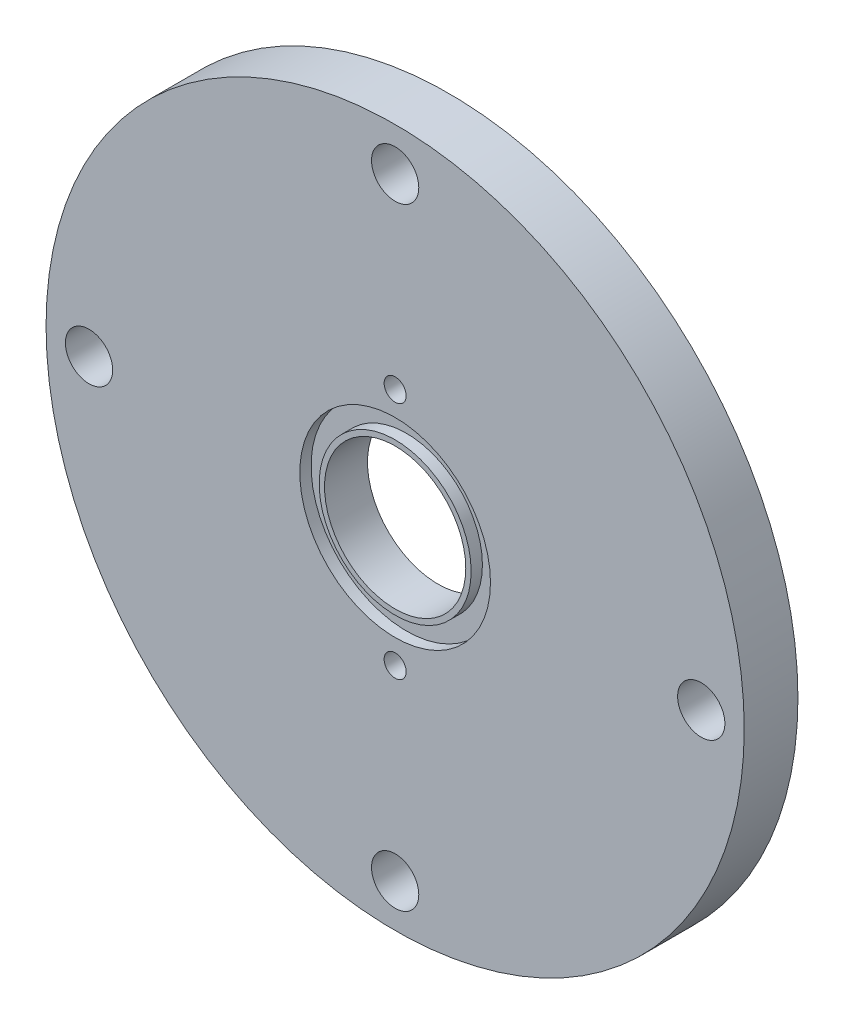
ISO-10303-21;
HEADER;
FILE_DESCRIPTION(('STEP AP214'),'2;1');
FILE_NAME('part.step','',(''),(''),'','','');
FILE_SCHEMA(('AUTOMOTIVE_DESIGN { 1 0 10303 214 1 1 1 1 }'));
ENDSEC;
DATA;
#1=APPLICATION_CONTEXT('core data for automotive mechanical design processes');
#2=APPLICATION_PROTOCOL_DEFINITION('international standard','automotive_design',2000,#1);
#3=PRODUCT_CONTEXT('',#1,'mechanical');
#4=PRODUCT('Part','Part','',(#3));
#5=PRODUCT_RELATED_PRODUCT_CATEGORY('part','',(#4));
#6=PRODUCT_DEFINITION_FORMATION('','',#4);
#7=PRODUCT_DEFINITION_CONTEXT('part definition',#1,'design');
#8=PRODUCT_DEFINITION('design','',#6,#7);
#9=PRODUCT_DEFINITION_SHAPE('','',#8);
#10=(LENGTH_UNIT() NAMED_UNIT(*) SI_UNIT(.MILLI.,.METRE.));
#11=(NAMED_UNIT(*) PLANE_ANGLE_UNIT() SI_UNIT($,.RADIAN.));
#12=(NAMED_UNIT(*) SI_UNIT($,.STERADIAN.) SOLID_ANGLE_UNIT());
#13=UNCERTAINTY_MEASURE_WITH_UNIT(LENGTH_MEASURE(1.E-05),#10,'distance_accuracy_value','');
#14=(GEOMETRIC_REPRESENTATION_CONTEXT(3) GLOBAL_UNCERTAINTY_ASSIGNED_CONTEXT((#13)) GLOBAL_UNIT_ASSIGNED_CONTEXT((#10,
#11,#12)) REPRESENTATION_CONTEXT('',''));
#15=CARTESIAN_POINT('',(0.,0.,0.));
#16=DIRECTION('',(0.,0.,1.));
#17=DIRECTION('',(1.,0.,0.));
#18=AXIS2_PLACEMENT_3D('',#15,#16,#17);
#19=CARTESIAN_POINT('',(20.,0.,-5.));
#20=DIRECTION('',(0.,0.,1.));
#21=DIRECTION('',(1.,0.,0.));
#22=AXIS2_PLACEMENT_3D('',#19,#20,#21);
#23=PLANE('',#22);
#24=CARTESIAN_POINT('',(20.,0.,-5.));
#25=DIRECTION('',(0.,0.,1.));
#26=DIRECTION('',(1.,0.,0.));
#27=AXIS2_PLACEMENT_3D('',#24,#25,#26);
#28=CIRCLE('',#27,8.875);
#29=CARTESIAN_POINT('',(28.875,0.,-5.));
#30=VERTEX_POINT('',#29);
#31=EDGE_CURVE('E189',#30,#30,#28,.T.);
#32=ORIENTED_EDGE('',*,*,#31,.T.);
#33=EDGE_LOOP('',(#32));
#34=FACE_BOUND('',#33,.T.);
#35=CARTESIAN_POINT('',(20.,0.,-5.));
#36=DIRECTION('',(0.,0.,-1.));
#37=DIRECTION('',(-1.,0.,0.));
#38=AXIS2_PLACEMENT_3D('',#35,#36,#37);
#39=CIRCLE('',#38,15.6);
#40=CARTESIAN_POINT('',(4.39999999999999,0.,-5.));
#41=VERTEX_POINT('',#40);
#42=EDGE_CURVE('E234',#41,#41,#39,.T.);
#43=ORIENTED_EDGE('',*,*,#42,.T.);
#44=EDGE_LOOP('',(#43));
#45=FACE_BOUND('',#44,.T.);
#46=ADVANCED_FACE('F47',(#34,#45),#23,.F.);
#47=CARTESIAN_POINT('',(0.,0.,-3.99999999999999));
#48=DIRECTION('',(0.,0.,1.));
#49=DIRECTION('',(1.,0.,0.));
#50=AXIS2_PLACEMENT_3D('',#47,#48,#49);
#51=PLANE('',#50);
#52=CARTESIAN_POINT('',(20.,0.,-3.99999999999999));
#53=DIRECTION('',(0.,0.,1.));
#54=DIRECTION('',(1.,0.,0.));
#55=AXIS2_PLACEMENT_3D('',#52,#53,#54);
#56=CIRCLE('',#55,6.575);
#57=CARTESIAN_POINT('',(26.575,0.,-3.99999999999999));
#58=VERTEX_POINT('',#57);
#59=EDGE_CURVE('E84',#58,#58,#56,.T.);
#60=ORIENTED_EDGE('',*,*,#59,.T.);
#61=EDGE_LOOP('',(#60));
#62=FACE_BOUND('',#61,.T.);
#63=CARTESIAN_POINT('',(20.,0.,-3.99999999999999));
#64=DIRECTION('',(0.,0.,1.));
#65=DIRECTION('',(1.,0.,0.));
#66=AXIS2_PLACEMENT_3D('',#63,#64,#65);
#67=CIRCLE('',#66,8.875);
#68=CARTESIAN_POINT('',(28.875,0.,-3.99999999999999));
#69=VERTEX_POINT('',#68);
#70=EDGE_CURVE('E11',#69,#69,#67,.T.);
#71=ORIENTED_EDGE('',*,*,#70,.F.);
#72=EDGE_LOOP('',(#71));
#73=FACE_BOUND('',#72,.T.);
#74=ADVANCED_FACE('F127',(#62,#73),#51,.F.);
#75=CARTESIAN_POINT('',(0.,0.,0.));
#76=DIRECTION('',(0.,0.,1.));
#77=DIRECTION('',(1.,0.,0.));
#78=AXIS2_PLACEMENT_3D('',#75,#76,#77);
#79=PLANE('',#78);
#80=CARTESIAN_POINT('',(20.,0.,0.));
#81=DIRECTION('',(0.,0.,1.));
#82=DIRECTION('',(1.,0.,0.));
#83=AXIS2_PLACEMENT_3D('',#80,#81,#82);
#84=CIRCLE('',#83,6.575);
#85=CARTESIAN_POINT('',(26.575,0.,0.));
#86=VERTEX_POINT('',#85);
#87=EDGE_CURVE('E89',#86,#86,#84,.T.);
#88=ORIENTED_EDGE('',*,*,#87,.F.);
#89=EDGE_LOOP('',(#88));
#90=FACE_BOUND('',#89,.T.);
#91=CARTESIAN_POINT('',(20.,0.,0.));
#92=DIRECTION('',(0.,0.,1.));
#93=DIRECTION('',(1.,0.,0.));
#94=AXIS2_PLACEMENT_3D('',#91,#92,#93);
#95=CIRCLE('',#94,7.075);
#96=CARTESIAN_POINT('',(27.075,0.,0.));
#97=VERTEX_POINT('',#96);
#98=EDGE_CURVE('E71',#97,#97,#95,.T.);
#99=ORIENTED_EDGE('',*,*,#98,.T.);
#100=EDGE_LOOP('',(#99));
#101=FACE_BOUND('',#100,.T.);
#102=ADVANCED_FACE('F132',(#90,#101),#79,.T.);
#103=CARTESIAN_POINT('',(20.,11.1252,-3.99999999999999));
#104=DIRECTION('',(0.,0.,1.));
#105=DIRECTION('',(1.,0.,0.));
#106=AXIS2_PLACEMENT_3D('',#103,#104,#105);
#107=CYLINDRICAL_SURFACE('',#106,1.025);
#108=CARTESIAN_POINT('',(20.,11.1252,-2.25));
#109=DIRECTION('',(0.,0.,1.));
#110=DIRECTION('',(1.,0.,0.));
#111=AXIS2_PLACEMENT_3D('',#108,#109,#110);
#112=CIRCLE('',#111,1.025);
#113=CARTESIAN_POINT('',(21.025,11.1252,-2.25));
#114=VERTEX_POINT('',#113);
#115=EDGE_CURVE('E51',#114,#114,#112,.F.);
#116=ORIENTED_EDGE('',*,*,#115,.T.);
#117=EDGE_LOOP('',(#116));
#118=FACE_BOUND('',#117,.T.);
#119=CARTESIAN_POINT('',(20.,11.1252,0.));
#120=DIRECTION('',(0.,0.,1.));
#121=DIRECTION('',(1.,0.,0.));
#122=AXIS2_PLACEMENT_3D('',#119,#120,#121);
#123=CIRCLE('',#122,1.025);
#124=CARTESIAN_POINT('',(21.025,11.1252,0.));
#125=VERTEX_POINT('',#124);
#126=EDGE_CURVE('E93',#125,#125,#123,.F.);
#127=ORIENTED_EDGE('',*,*,#126,.F.);
#128=EDGE_LOOP('',(#127));
#129=FACE_BOUND('',#128,.T.);
#130=ADVANCED_FACE('F170',(#118,#129),#107,.F.);
#131=CARTESIAN_POINT('',(20.,-11.1252,-3.99999999999999));
#132=DIRECTION('',(0.,0.,1.));
#133=DIRECTION('',(1.,0.,0.));
#134=AXIS2_PLACEMENT_3D('',#131,#132,#133);
#135=CYLINDRICAL_SURFACE('',#134,1.025);
#136=CARTESIAN_POINT('',(20.,-11.1252,-2.25));
#137=DIRECTION('',(0.,0.,1.));
#138=DIRECTION('',(1.,0.,0.));
#139=AXIS2_PLACEMENT_3D('',#136,#137,#138);
#140=CIRCLE('',#139,1.025);
#141=CARTESIAN_POINT('',(21.025,-11.1252,-2.25));
#142=VERTEX_POINT('',#141);
#143=EDGE_CURVE('E103',#142,#142,#140,.F.);
#144=ORIENTED_EDGE('',*,*,#143,.T.);
#145=EDGE_LOOP('',(#144));
#146=FACE_BOUND('',#145,.T.);
#147=CARTESIAN_POINT('',(20.,-11.1252,0.));
#148=DIRECTION('',(0.,0.,1.));
#149=DIRECTION('',(1.,0.,0.));
#150=AXIS2_PLACEMENT_3D('',#147,#148,#149);
#151=CIRCLE('',#150,1.025);
#152=CARTESIAN_POINT('',(21.025,-11.1252,0.));
#153=VERTEX_POINT('',#152);
#154=EDGE_CURVE('E80',#153,#153,#151,.F.);
#155=ORIENTED_EDGE('',*,*,#154,.F.);
#156=EDGE_LOOP('',(#155));
#157=FACE_BOUND('',#156,.T.);
#158=ADVANCED_FACE('F168',(#146,#157),#135,.F.);
#159=CARTESIAN_POINT('',(20.,0.,-3.99999999999999));
#160=DIRECTION('',(0.,0.,1.));
#161=DIRECTION('',(1.,0.,0.));
#162=AXIS2_PLACEMENT_3D('',#159,#160,#161);
#163=CYLINDRICAL_SURFACE('',#162,6.575);
#164=ORIENTED_EDGE('',*,*,#59,.F.);
#165=EDGE_LOOP('',(#164));
#166=FACE_BOUND('',#165,.T.);
#167=ORIENTED_EDGE('',*,*,#87,.T.);
#168=EDGE_LOOP('',(#167));
#169=FACE_BOUND('',#168,.T.);
#170=ADVANCED_FACE('F164',(#166,#169),#163,.F.);
#171=CARTESIAN_POINT('',(20.,-28.5,0.));
#172=DIRECTION('',(0.,0.,1.));
#173=DIRECTION('',(1.,0.,0.));
#174=AXIS2_PLACEMENT_3D('',#171,#172,#173);
#175=CIRCLE('',#174,2.19999999999999);
#176=CARTESIAN_POINT('',(22.2,-28.5,0.));
#177=VERTEX_POINT('',#176);
#178=EDGE_CURVE('E198',#177,#177,#175,.F.);
#179=ORIENTED_EDGE('',*,*,#178,.T.);
#180=EDGE_LOOP('',(#179));
#181=FACE_BOUND('',#180,.T.);
#182=CARTESIAN_POINT('',(48.4962655333548,-0.461357402168694,0.));
#183=DIRECTION('',(0.,0.,1.));
#184=DIRECTION('',(1.,0.,0.));
#185=AXIS2_PLACEMENT_3D('',#182,#183,#184);
#186=CIRCLE('',#185,2.2);
#187=CARTESIAN_POINT('',(50.6962655333548,-0.461357402168694,0.));
#188=VERTEX_POINT('',#187);
#189=EDGE_CURVE('E222',#188,#188,#186,.F.);
#190=ORIENTED_EDGE('',*,*,#189,.T.);
#191=EDGE_LOOP('',(#190));
#192=FACE_BOUND('',#191,.T.);
#193=CARTESIAN_POINT('',(20.,28.5,0.));
#194=DIRECTION('',(0.,0.,1.));
#195=DIRECTION('',(1.,0.,0.));
#196=AXIS2_PLACEMENT_3D('',#193,#194,#195);
#197=CIRCLE('',#196,2.19999999999999);
#198=CARTESIAN_POINT('',(22.2,28.5,0.));
#199=VERTEX_POINT('',#198);
#200=EDGE_CURVE('E214',#199,#199,#197,.F.);
#201=ORIENTED_EDGE('',*,*,#200,.T.);
#202=EDGE_LOOP('',(#201));
#203=FACE_BOUND('',#202,.T.);
#204=CARTESIAN_POINT('',(-8.49626553335479,-0.461357402168693,0.));
#205=DIRECTION('',(0.,0.,1.));
#206=DIRECTION('',(1.,0.,0.));
#207=AXIS2_PLACEMENT_3D('',#204,#205,#206);
#208=CIRCLE('',#207,2.2);
#209=CARTESIAN_POINT('',(-6.29626553335479,-0.461357402168693,0.));
#210=VERTEX_POINT('',#209);
#211=EDGE_CURVE('E205',#210,#210,#208,.F.);
#212=ORIENTED_EDGE('',*,*,#211,.T.);
#213=EDGE_LOOP('',(#212));
#214=FACE_BOUND('',#213,.T.);
#215=CARTESIAN_POINT('',(20.,0.,0.));
#216=DIRECTION('',(0.,0.,1.));
#217=DIRECTION('',(1.,0.,0.));
#218=AXIS2_PLACEMENT_3D('',#215,#216,#217);
#219=CIRCLE('',#218,8.875);
#220=CARTESIAN_POINT('',(28.875,0.,0.));
#221=VERTEX_POINT('',#220);
#222=EDGE_CURVE('E70',#221,#221,#219,.T.);
#223=ORIENTED_EDGE('',*,*,#222,.F.);
#224=EDGE_LOOP('',(#223));
#225=FACE_BOUND('',#224,.T.);
#226=ORIENTED_EDGE('',*,*,#154,.T.);
#227=EDGE_LOOP('',(#226));
#228=FACE_BOUND('',#227,.T.);
#229=ORIENTED_EDGE('',*,*,#126,.T.);
#230=EDGE_LOOP('',(#229));
#231=FACE_BOUND('',#230,.T.);
#232=CARTESIAN_POINT('',(20.,0.,0.));
#233=DIRECTION('',(0.,0.,1.));
#234=DIRECTION('',(1.,0.,0.));
#235=AXIS2_PLACEMENT_3D('',#232,#233,#234);
#236=CIRCLE('',#235,32.5);
#237=CARTESIAN_POINT('',(52.5,0.,0.));
#238=VERTEX_POINT('',#237);
#239=EDGE_CURVE('E64',#238,#238,#236,.T.);
#240=ORIENTED_EDGE('',*,*,#239,.T.);
#241=EDGE_LOOP('',(#240));
#242=FACE_BOUND('',#241,.T.);
#243=ADVANCED_FACE('F159',(#181,#192,#203,#214,#225,#228,#231,#242),#79,.T.);
#244=CARTESIAN_POINT('',(20.,0.,-1.05));
#245=DIRECTION('',(0.,0.,1.));
#246=DIRECTION('',(1.,0.,0.));
#247=AXIS2_PLACEMENT_3D('',#244,#245,#246);
#248=CYLINDRICAL_SURFACE('',#247,8.875);
#249=CARTESIAN_POINT('',(20.,0.,-1.05));
#250=DIRECTION('',(0.,0.,1.));
#251=DIRECTION('',(1.,0.,0.));
#252=AXIS2_PLACEMENT_3D('',#249,#250,#251);
#253=CIRCLE('',#252,8.875);
#254=CARTESIAN_POINT('',(28.875,0.,-1.05));
#255=VERTEX_POINT('',#254);
#256=EDGE_CURVE('E76',#255,#255,#253,.T.);
#257=ORIENTED_EDGE('',*,*,#256,.F.);
#258=EDGE_LOOP('',(#257));
#259=FACE_BOUND('',#258,.T.);
#260=ORIENTED_EDGE('',*,*,#222,.T.);
#261=EDGE_LOOP('',(#260));
#262=FACE_BOUND('',#261,.T.);
#263=ADVANCED_FACE('F156',(#259,#262),#248,.F.);
#264=CARTESIAN_POINT('',(20.,0.,-1.05));
#265=DIRECTION('',(0.,0.,1.));
#266=DIRECTION('',(1.,0.,0.));
#267=AXIS2_PLACEMENT_3D('',#264,#265,#266);
#268=PLANE('',#267);
#269=CARTESIAN_POINT('',(20.,0.,-1.05));
#270=DIRECTION('',(0.,0.,1.));
#271=DIRECTION('',(1.,0.,0.));
#272=AXIS2_PLACEMENT_3D('',#269,#270,#271);
#273=CIRCLE('',#272,7.075);
#274=CARTESIAN_POINT('',(27.075,0.,-1.05));
#275=VERTEX_POINT('',#274);
#276=EDGE_CURVE('E66',#275,#275,#273,.T.);
#277=ORIENTED_EDGE('',*,*,#276,.F.);
#278=EDGE_LOOP('',(#277));
#279=FACE_BOUND('',#278,.T.);
#280=ORIENTED_EDGE('',*,*,#256,.T.);
#281=EDGE_LOOP('',(#280));
#282=FACE_BOUND('',#281,.T.);
#283=ADVANCED_FACE('F152',(#279,#282),#268,.T.);
#284=CARTESIAN_POINT('',(20.,0.,-1.05));
#285=DIRECTION('',(0.,0.,1.));
#286=DIRECTION('',(1.,0.,0.));
#287=AXIS2_PLACEMENT_3D('',#284,#285,#286);
#288=CYLINDRICAL_SURFACE('',#287,7.075);
#289=ORIENTED_EDGE('',*,*,#276,.T.);
#290=EDGE_LOOP('',(#289));
#291=FACE_BOUND('',#290,.T.);
#292=ORIENTED_EDGE('',*,*,#98,.F.);
#293=EDGE_LOOP('',(#292));
#294=FACE_BOUND('',#293,.T.);
#295=ADVANCED_FACE('F149',(#291,#294),#288,.T.);
#296=CARTESIAN_POINT('',(20.,11.1252,-3.25));
#297=DIRECTION('',(0.,0.,1.));
#298=DIRECTION('',(1.,0.,0.));
#299=AXIS2_PLACEMENT_3D('',#296,#297,#298);
#300=PLANE('',#299);
#301=CARTESIAN_POINT('',(20.,11.1252,-3.25));
#302=DIRECTION('',(0.,0.,1.));
#303=DIRECTION('',(1.,0.,0.));
#304=AXIS2_PLACEMENT_3D('',#301,#302,#303);
#305=CIRCLE('',#304,0.0250000000000001);
#306=CARTESIAN_POINT('',(20.025,11.1252,-3.25));
#307=VERTEX_POINT('',#306);
#308=EDGE_CURVE('E61',#307,#307,#305,.T.);
#309=ORIENTED_EDGE('',*,*,#308,.T.);
#310=EDGE_LOOP('',(#309));
#311=FACE_BOUND('',#310,.T.);
#312=ADVANCED_FACE('F110',(#311),#300,.T.);
#313=CARTESIAN_POINT('',(20.,-11.1252,-3.25));
#314=DIRECTION('',(0.,0.,1.));
#315=DIRECTION('',(1.,0.,0.));
#316=AXIS2_PLACEMENT_3D('',#313,#314,#315);
#317=PLANE('',#316);
#318=CARTESIAN_POINT('',(20.,-11.1252,-3.25));
#319=DIRECTION('',(0.,0.,1.));
#320=DIRECTION('',(1.,0.,0.));
#321=AXIS2_PLACEMENT_3D('',#318,#319,#320);
#322=CIRCLE('',#321,0.0250000000000001);
#323=CARTESIAN_POINT('',(20.025,-11.1252,-3.25));
#324=VERTEX_POINT('',#323);
#325=EDGE_CURVE('E88',#324,#324,#322,.T.);
#326=ORIENTED_EDGE('',*,*,#325,.T.);
#327=EDGE_LOOP('',(#326));
#328=FACE_BOUND('',#327,.T.);
#329=ADVANCED_FACE('F123',(#328),#317,.T.);
#330=CARTESIAN_POINT('',(20.,-11.1252,-2.25));
#331=DIRECTION('',(0.,0.,1.));
#332=DIRECTION('',(1.,0.,0.));
#333=AXIS2_PLACEMENT_3D('',#330,#331,#332);
#334=DEGENERATE_TOROIDAL_SURFACE('',#333,0.0250000000000001,1.,.T.);
#335=ORIENTED_EDGE('',*,*,#143,.F.);
#336=EDGE_LOOP('',(#335));
#337=FACE_BOUND('',#336,.T.);
#338=ORIENTED_EDGE('',*,*,#325,.F.);
#339=EDGE_LOOP('',(#338));
#340=FACE_BOUND('',#339,.T.);
#341=ADVANCED_FACE('F114',(#337,#340),#334,.F.);
#342=CARTESIAN_POINT('',(20.,11.1252,-2.25));
#343=DIRECTION('',(0.,0.,1.));
#344=DIRECTION('',(1.,0.,0.));
#345=AXIS2_PLACEMENT_3D('',#342,#343,#344);
#346=DEGENERATE_TOROIDAL_SURFACE('',#345,0.0250000000000001,1.,.T.);
#347=ORIENTED_EDGE('',*,*,#115,.F.);
#348=EDGE_LOOP('',(#347));
#349=FACE_BOUND('',#348,.T.);
#350=ORIENTED_EDGE('',*,*,#308,.F.);
#351=EDGE_LOOP('',(#350));
#352=FACE_BOUND('',#351,.T.);
#353=ADVANCED_FACE('F49',(#349,#352),#346,.F.);
#354=CARTESIAN_POINT('',(20.,0.,-5.));
#355=DIRECTION('',(0.,0.,-1.));
#356=DIRECTION('',(-1.,0.,0.));
#357=AXIS2_PLACEMENT_3D('',#354,#355,#356);
#358=CIRCLE('',#357,20.6);
#359=CARTESIAN_POINT('',(-0.60000000000001,0.,-5.));
#360=VERTEX_POINT('',#359);
#361=EDGE_CURVE('E229',#360,#360,#358,.T.);
#362=ORIENTED_EDGE('',*,*,#361,.F.);
#363=EDGE_LOOP('',(#362));
#364=FACE_BOUND('',#363,.T.);
#365=CARTESIAN_POINT('',(20.,-28.5,-5.));
#366=DIRECTION('',(0.,0.,1.));
#367=DIRECTION('',(1.,0.,0.));
#368=AXIS2_PLACEMENT_3D('',#365,#366,#367);
#369=CIRCLE('',#368,2.19999999999999);
#370=CARTESIAN_POINT('',(22.2,-28.5,-5.));
#371=VERTEX_POINT('',#370);
#372=EDGE_CURVE('E193',#371,#371,#369,.F.);
#373=ORIENTED_EDGE('',*,*,#372,.F.);
#374=EDGE_LOOP('',(#373));
#375=FACE_BOUND('',#374,.T.);
#376=CARTESIAN_POINT('',(48.4962655333548,-0.461357402168694,-5.));
#377=DIRECTION('',(0.,0.,1.));
#378=DIRECTION('',(1.,0.,0.));
#379=AXIS2_PLACEMENT_3D('',#376,#377,#378);
#380=CIRCLE('',#379,2.2);
#381=CARTESIAN_POINT('',(50.6962655333548,-0.461357402168694,-5.));
#382=VERTEX_POINT('',#381);
#383=EDGE_CURVE('E218',#382,#382,#380,.F.);
#384=ORIENTED_EDGE('',*,*,#383,.F.);
#385=EDGE_LOOP('',(#384));
#386=FACE_BOUND('',#385,.T.);
#387=CARTESIAN_POINT('',(20.,28.5,-5.));
#388=DIRECTION('',(0.,0.,1.));
#389=DIRECTION('',(1.,0.,0.));
#390=AXIS2_PLACEMENT_3D('',#387,#388,#389);
#391=CIRCLE('',#390,2.19999999999999);
#392=CARTESIAN_POINT('',(22.2,28.5,-5.));
#393=VERTEX_POINT('',#392);
#394=EDGE_CURVE('E210',#393,#393,#391,.F.);
#395=ORIENTED_EDGE('',*,*,#394,.F.);
#396=EDGE_LOOP('',(#395));
#397=FACE_BOUND('',#396,.T.);
#398=CARTESIAN_POINT('',(-8.49626553335479,-0.461357402168693,-5.));
#399=DIRECTION('',(0.,0.,1.));
#400=DIRECTION('',(1.,0.,0.));
#401=AXIS2_PLACEMENT_3D('',#398,#399,#400);
#402=CIRCLE('',#401,2.2);
#403=CARTESIAN_POINT('',(-6.29626553335479,-0.461357402168693,-5.));
#404=VERTEX_POINT('',#403);
#405=EDGE_CURVE('E201',#404,#404,#402,.F.);
#406=ORIENTED_EDGE('',*,*,#405,.F.);
#407=EDGE_LOOP('',(#406));
#408=FACE_BOUND('',#407,.T.);
#409=CARTESIAN_POINT('',(20.,0.,-5.));
#410=DIRECTION('',(0.,0.,1.));
#411=DIRECTION('',(1.,0.,0.));
#412=AXIS2_PLACEMENT_3D('',#409,#410,#411);
#413=CIRCLE('',#412,32.5);
#414=CARTESIAN_POINT('',(52.5,0.,-5.));
#415=VERTEX_POINT('',#414);
#416=EDGE_CURVE('E75',#415,#415,#413,.T.);
#417=ORIENTED_EDGE('',*,*,#416,.F.);
#418=EDGE_LOOP('',(#417));
#419=FACE_BOUND('',#418,.T.);
#420=ADVANCED_FACE('F113',(#364,#375,#386,#397,#408,#419),#23,.F.);
#421=CARTESIAN_POINT('',(20.,0.,-5.));
#422=DIRECTION('',(0.,0.,1.));
#423=DIRECTION('',(1.,0.,0.));
#424=AXIS2_PLACEMENT_3D('',#421,#422,#423);
#425=CYLINDRICAL_SURFACE('',#424,32.5);
#426=ORIENTED_EDGE('',*,*,#416,.T.);
#427=EDGE_LOOP('',(#426));
#428=FACE_BOUND('',#427,.T.);
#429=ORIENTED_EDGE('',*,*,#239,.F.);
#430=EDGE_LOOP('',(#429));
#431=FACE_BOUND('',#430,.T.);
#432=ADVANCED_FACE('F120',(#428,#431),#425,.T.);
#433=CARTESIAN_POINT('',(20.,0.,-5.));
#434=DIRECTION('',(0.,0.,1.));
#435=DIRECTION('',(1.,0.,0.));
#436=AXIS2_PLACEMENT_3D('',#433,#434,#435);
#437=CYLINDRICAL_SURFACE('',#436,8.875);
#438=ORIENTED_EDGE('',*,*,#31,.F.);
#439=EDGE_LOOP('',(#438));
#440=FACE_BOUND('',#439,.T.);
#441=ORIENTED_EDGE('',*,*,#70,.T.);
#442=EDGE_LOOP('',(#441));
#443=FACE_BOUND('',#442,.T.);
#444=ADVANCED_FACE('F139',(#440,#443),#437,.F.);
#445=CARTESIAN_POINT('',(-8.49626553335479,-0.461357402168693,-5.));
#446=DIRECTION('',(0.,0.,1.));
#447=DIRECTION('',(1.,0.,0.));
#448=AXIS2_PLACEMENT_3D('',#445,#446,#447);
#449=CYLINDRICAL_SURFACE('',#448,2.2);
#450=ORIENTED_EDGE('',*,*,#405,.T.);
#451=EDGE_LOOP('',(#450));
#452=FACE_BOUND('',#451,.T.);
#453=ORIENTED_EDGE('',*,*,#211,.F.);
#454=EDGE_LOOP('',(#453));
#455=FACE_BOUND('',#454,.T.);
#456=ADVANCED_FACE('F270',(#452,#455),#449,.F.);
#457=CARTESIAN_POINT('',(20.,28.5,-5.));
#458=DIRECTION('',(0.,0.,1.));
#459=DIRECTION('',(1.,0.,0.));
#460=AXIS2_PLACEMENT_3D('',#457,#458,#459);
#461=CYLINDRICAL_SURFACE('',#460,2.19999999999999);
#462=ORIENTED_EDGE('',*,*,#394,.T.);
#463=EDGE_LOOP('',(#462));
#464=FACE_BOUND('',#463,.T.);
#465=ORIENTED_EDGE('',*,*,#200,.F.);
#466=EDGE_LOOP('',(#465));
#467=FACE_BOUND('',#466,.T.);
#468=ADVANCED_FACE('F273',(#464,#467),#461,.F.);
#469=CARTESIAN_POINT('',(48.4962655333548,-0.461357402168694,-5.));
#470=DIRECTION('',(0.,0.,1.));
#471=DIRECTION('',(1.,0.,0.));
#472=AXIS2_PLACEMENT_3D('',#469,#470,#471);
#473=CYLINDRICAL_SURFACE('',#472,2.2);
#474=ORIENTED_EDGE('',*,*,#383,.T.);
#475=EDGE_LOOP('',(#474));
#476=FACE_BOUND('',#475,.T.);
#477=ORIENTED_EDGE('',*,*,#189,.F.);
#478=EDGE_LOOP('',(#477));
#479=FACE_BOUND('',#478,.T.);
#480=ADVANCED_FACE('F283',(#476,#479),#473,.F.);
#481=CARTESIAN_POINT('',(20.,-28.5,-5.));
#482=DIRECTION('',(0.,0.,1.));
#483=DIRECTION('',(1.,0.,0.));
#484=AXIS2_PLACEMENT_3D('',#481,#482,#483);
#485=CYLINDRICAL_SURFACE('',#484,2.19999999999999);
#486=ORIENTED_EDGE('',*,*,#372,.T.);
#487=EDGE_LOOP('',(#486));
#488=FACE_BOUND('',#487,.T.);
#489=ORIENTED_EDGE('',*,*,#178,.F.);
#490=EDGE_LOOP('',(#489));
#491=FACE_BOUND('',#490,.T.);
#492=ADVANCED_FACE('F290',(#488,#491),#485,.F.);
#493=CARTESIAN_POINT('',(20.,0.,-2.5));
#494=DIRECTION('',(0.,0.,-1.));
#495=DIRECTION('',(-1.,0.,0.));
#496=AXIS2_PLACEMENT_3D('',#493,#494,#495);
#497=CYLINDRICAL_SURFACE('',#496,15.6);
#498=CARTESIAN_POINT('',(20.,0.,-2.5));
#499=DIRECTION('',(0.,0.,-1.));
#500=DIRECTION('',(-1.,0.,0.));
#501=AXIS2_PLACEMENT_3D('',#498,#499,#500);
#502=CIRCLE('',#501,15.6);
#503=CARTESIAN_POINT('',(4.39999999999999,0.,-2.5));
#504=VERTEX_POINT('',#503);
#505=EDGE_CURVE('E233',#504,#504,#502,.T.);
#506=ORIENTED_EDGE('',*,*,#505,.T.);
#507=EDGE_LOOP('',(#506));
#508=FACE_BOUND('',#507,.T.);
#509=ORIENTED_EDGE('',*,*,#42,.F.);
#510=EDGE_LOOP('',(#509));
#511=FACE_BOUND('',#510,.T.);
#512=ADVANCED_FACE('F245',(#508,#511),#497,.T.);
#513=CARTESIAN_POINT('',(20.,0.,-2.5));
#514=DIRECTION('',(0.,0.,-1.));
#515=DIRECTION('',(-1.,0.,0.));
#516=AXIS2_PLACEMENT_3D('',#513,#514,#515);
#517=CYLINDRICAL_SURFACE('',#516,20.6);
#518=CARTESIAN_POINT('',(20.,0.,-2.5));
#519=DIRECTION('',(0.,0.,-1.));
#520=DIRECTION('',(-1.,0.,0.));
#521=AXIS2_PLACEMENT_3D('',#518,#519,#520);
#522=CIRCLE('',#521,20.6);
#523=CARTESIAN_POINT('',(-0.60000000000001,0.,-2.5));
#524=VERTEX_POINT('',#523);
#525=EDGE_CURVE('E206',#524,#524,#522,.T.);
#526=ORIENTED_EDGE('',*,*,#525,.F.);
#527=EDGE_LOOP('',(#526));
#528=FACE_BOUND('',#527,.T.);
#529=ORIENTED_EDGE('',*,*,#361,.T.);
#530=EDGE_LOOP('',(#529));
#531=FACE_BOUND('',#530,.T.);
#532=ADVANCED_FACE('F251',(#528,#531),#517,.F.);
#533=CARTESIAN_POINT('',(0.,0.,-2.5));
#534=DIRECTION('',(0.,0.,-1.));
#535=DIRECTION('',(-1.,0.,0.));
#536=AXIS2_PLACEMENT_3D('',#533,#534,#535);
#537=PLANE('',#536);
#538=ORIENTED_EDGE('',*,*,#505,.F.);
#539=EDGE_LOOP('',(#538));
#540=FACE_BOUND('',#539,.T.);
#541=ORIENTED_EDGE('',*,*,#525,.T.);
#542=EDGE_LOOP('',(#541));
#543=FACE_BOUND('',#542,.T.);
#544=ADVANCED_FACE('F248',(#540,#543),#537,.T.);
#545=CLOSED_SHELL('',(#46,#74,#102,#130,#158,#170,#243,#263,#283,#295,#312,#329,#341,#353,#420,
#432,#444,#456,#468,#480,#492,#512,#532,#544));
#546=MANIFOLD_SOLID_BREP('B2',#545);
#547=ADVANCED_BREP_SHAPE_REPRESENTATION('',(#18,#546),#14);
#548=SHAPE_DEFINITION_REPRESENTATION(#9,#547);
ENDSEC;
END-ISO-10303-21;
